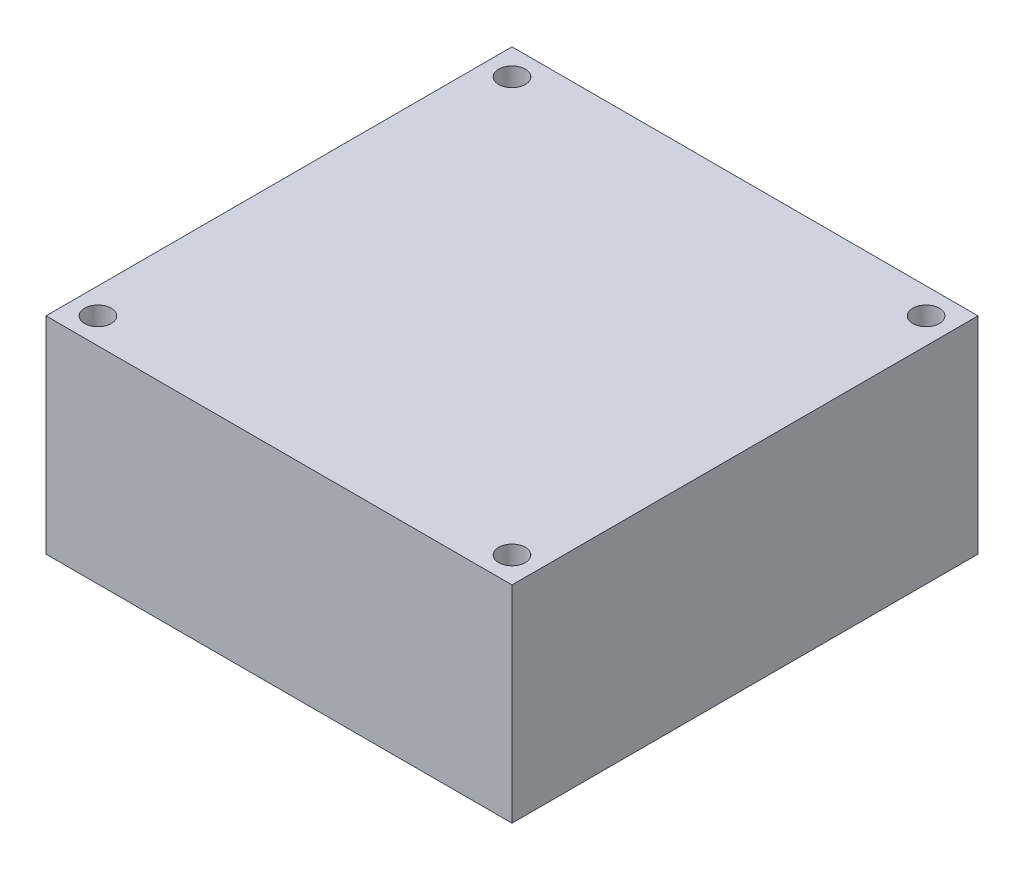
ISO-10303-21;
HEADER;
FILE_DESCRIPTION(('STEP AP214'),'2;1');
FILE_NAME('part.step','',(''),(''),'','','');
FILE_SCHEMA(('AUTOMOTIVE_DESIGN { 1 0 10303 214 1 1 1 1 }'));
ENDSEC;
DATA;
#1=APPLICATION_CONTEXT('core data for automotive mechanical design processes');
#2=APPLICATION_PROTOCOL_DEFINITION('international standard','automotive_design',2000,#1);
#3=PRODUCT_CONTEXT('',#1,'mechanical');
#4=PRODUCT('Part','Part','',(#3));
#5=PRODUCT_RELATED_PRODUCT_CATEGORY('part','',(#4));
#6=PRODUCT_DEFINITION_FORMATION('','',#4);
#7=PRODUCT_DEFINITION_CONTEXT('part definition',#1,'design');
#8=PRODUCT_DEFINITION('design','',#6,#7);
#9=PRODUCT_DEFINITION_SHAPE('','',#8);
#10=(LENGTH_UNIT() NAMED_UNIT(*) SI_UNIT(.MILLI.,.METRE.));
#11=(NAMED_UNIT(*) PLANE_ANGLE_UNIT() SI_UNIT($,.RADIAN.));
#12=(NAMED_UNIT(*) SI_UNIT($,.STERADIAN.) SOLID_ANGLE_UNIT());
#13=UNCERTAINTY_MEASURE_WITH_UNIT(LENGTH_MEASURE(1.E-05),#10,'distance_accuracy_value','');
#14=(GEOMETRIC_REPRESENTATION_CONTEXT(3) GLOBAL_UNCERTAINTY_ASSIGNED_CONTEXT((#13)) GLOBAL_UNIT_ASSIGNED_CONTEXT((#10,
#11,#12)) REPRESENTATION_CONTEXT('',''));
#15=CARTESIAN_POINT('',(0.,0.,0.));
#16=DIRECTION('',(0.,0.,1.));
#17=DIRECTION('',(1.,0.,0.));
#18=AXIS2_PLACEMENT_3D('',#15,#16,#17);
#19=CARTESIAN_POINT('',(35.,31.,-35.));
#20=DIRECTION('',(-1.,0.,0.));
#21=DIRECTION('',(0.,0.,1.));
#22=AXIS2_PLACEMENT_3D('',#19,#20,#21);
#23=PLANE('',#22);
#24=DIRECTION('',(0.,0.,-1.));
#25=VECTOR('',#24,1.);
#26=CARTESIAN_POINT('',(35.,0.,-35.));
#27=LINE('',#26,#25);
#28=CARTESIAN_POINT('',(35.,0.,35.));
#29=VERTEX_POINT('',#28);
#30=CARTESIAN_POINT('',(35.,0.,-35.));
#31=VERTEX_POINT('',#30);
#32=EDGE_CURVE('E96',#29,#31,#27,.T.);
#33=ORIENTED_EDGE('',*,*,#32,.T.);
#34=DIRECTION('',(0.,-1.,0.));
#35=VECTOR('',#34,1.);
#36=CARTESIAN_POINT('',(35.,31.,-35.));
#37=LINE('',#36,#35);
#38=CARTESIAN_POINT('',(35.,31.,-35.));
#39=VERTEX_POINT('',#38);
#40=EDGE_CURVE('E11',#39,#31,#37,.T.);
#41=ORIENTED_EDGE('',*,*,#40,.F.);
#42=DIRECTION('',(0.,0.,-1.));
#43=VECTOR('',#42,1.);
#44=CARTESIAN_POINT('',(35.,31.,-35.));
#45=LINE('',#44,#43);
#46=CARTESIAN_POINT('',(35.,31.,35.));
#47=VERTEX_POINT('',#46);
#48=EDGE_CURVE('E84',#47,#39,#45,.T.);
#49=ORIENTED_EDGE('',*,*,#48,.F.);
#50=DIRECTION('',(0.,-1.,0.));
#51=VECTOR('',#50,1.);
#52=CARTESIAN_POINT('',(35.,31.,35.));
#53=LINE('',#52,#51);
#54=EDGE_CURVE('E92',#47,#29,#53,.T.);
#55=ORIENTED_EDGE('',*,*,#54,.T.);
#56=EDGE_LOOP('',(#33,#41,#49,#55));
#57=FACE_BOUND('',#56,.T.);
#58=ADVANCED_FACE('F33',(#57),#23,.F.);
#59=CARTESIAN_POINT('',(-35.,31.,-35.));
#60=DIRECTION('',(0.,0.,1.));
#61=DIRECTION('',(1.,0.,0.));
#62=AXIS2_PLACEMENT_3D('',#59,#60,#61);
#63=PLANE('',#62);
#64=DIRECTION('',(-1.,0.,0.));
#65=VECTOR('',#64,1.);
#66=CARTESIAN_POINT('',(-35.,0.,-35.));
#67=LINE('',#66,#65);
#68=CARTESIAN_POINT('',(-35.,0.,-35.));
#69=VERTEX_POINT('',#68);
#70=EDGE_CURVE('E88',#31,#69,#67,.T.);
#71=ORIENTED_EDGE('',*,*,#70,.T.);
#72=DIRECTION('',(0.,-1.,0.));
#73=VECTOR('',#72,1.);
#74=CARTESIAN_POINT('',(-35.,31.,-35.));
#75=LINE('',#74,#73);
#76=CARTESIAN_POINT('',(-35.,31.,-35.));
#77=VERTEX_POINT('',#76);
#78=EDGE_CURVE('E41',#77,#69,#75,.T.);
#79=ORIENTED_EDGE('',*,*,#78,.F.);
#80=DIRECTION('',(-1.,0.,0.));
#81=VECTOR('',#80,1.);
#82=CARTESIAN_POINT('',(-35.,31.,-35.));
#83=LINE('',#82,#81);
#84=EDGE_CURVE('E79',#39,#77,#83,.T.);
#85=ORIENTED_EDGE('',*,*,#84,.F.);
#86=ORIENTED_EDGE('',*,*,#40,.T.);
#87=EDGE_LOOP('',(#71,#79,#85,#86));
#88=FACE_BOUND('',#87,.T.);
#89=ADVANCED_FACE('F87',(#88),#63,.F.);
#90=CARTESIAN_POINT('',(-35.,31.,-35.));
#91=DIRECTION('',(1.,0.,0.));
#92=DIRECTION('',(0.,0.,-1.));
#93=AXIS2_PLACEMENT_3D('',#90,#91,#92);
#94=PLANE('',#93);
#95=DIRECTION('',(0.,0.,1.));
#96=VECTOR('',#95,1.);
#97=CARTESIAN_POINT('',(-35.,0.,-35.));
#98=LINE('',#97,#96);
#99=CARTESIAN_POINT('',(-35.,0.,35.));
#100=VERTEX_POINT('',#99);
#101=EDGE_CURVE('E66',#69,#100,#98,.T.);
#102=ORIENTED_EDGE('',*,*,#101,.T.);
#103=DIRECTION('',(0.,-1.,0.));
#104=VECTOR('',#103,1.);
#105=CARTESIAN_POINT('',(-35.,31.,35.));
#106=LINE('',#105,#104);
#107=CARTESIAN_POINT('',(-35.,31.,35.));
#108=VERTEX_POINT('',#107);
#109=EDGE_CURVE('E89',#108,#100,#106,.T.);
#110=ORIENTED_EDGE('',*,*,#109,.F.);
#111=DIRECTION('',(0.,0.,1.));
#112=VECTOR('',#111,1.);
#113=CARTESIAN_POINT('',(-35.,31.,-35.));
#114=LINE('',#113,#112);
#115=EDGE_CURVE('E82',#77,#108,#114,.T.);
#116=ORIENTED_EDGE('',*,*,#115,.F.);
#117=ORIENTED_EDGE('',*,*,#78,.T.);
#118=EDGE_LOOP('',(#102,#110,#116,#117));
#119=FACE_BOUND('',#118,.T.);
#120=ADVANCED_FACE('F90',(#119),#94,.F.);
#121=CARTESIAN_POINT('',(-35.,31.,35.));
#122=DIRECTION('',(0.,0.,-1.));
#123=DIRECTION('',(-1.,0.,0.));
#124=AXIS2_PLACEMENT_3D('',#121,#122,#123);
#125=PLANE('',#124);
#126=DIRECTION('',(1.,0.,0.));
#127=VECTOR('',#126,1.);
#128=CARTESIAN_POINT('',(-35.,0.,35.));
#129=LINE('',#128,#127);
#130=EDGE_CURVE('E72',#100,#29,#129,.T.);
#131=ORIENTED_EDGE('',*,*,#130,.T.);
#132=ORIENTED_EDGE('',*,*,#54,.F.);
#133=DIRECTION('',(1.,0.,0.));
#134=VECTOR('',#133,1.);
#135=CARTESIAN_POINT('',(-35.,31.,35.));
#136=LINE('',#135,#134);
#137=EDGE_CURVE('E49',#108,#47,#136,.T.);
#138=ORIENTED_EDGE('',*,*,#137,.F.);
#139=ORIENTED_EDGE('',*,*,#109,.T.);
#140=EDGE_LOOP('',(#131,#132,#138,#139));
#141=FACE_BOUND('',#140,.T.);
#142=ADVANCED_FACE('F104',(#141),#125,.F.);
#143=CARTESIAN_POINT('',(0.,31.,0.));
#144=DIRECTION('',(0.,1.,0.));
#145=DIRECTION('',(0.,0.,1.));
#146=AXIS2_PLACEMENT_3D('',#143,#144,#145);
#147=PLANE('',#146);
#148=CARTESIAN_POINT('',(-31.1,31.,31.1));
#149=DIRECTION('',(0.,1.,0.));
#150=DIRECTION('',(0.,0.,1.));
#151=AXIS2_PLACEMENT_3D('',#148,#149,#150);
#152=CIRCLE('',#151,2.00000000000001);
#153=CARTESIAN_POINT('',(-31.1,31.,33.1));
#154=VERTEX_POINT('',#153);
#155=EDGE_CURVE('E128',#154,#154,#152,.T.);
#156=ORIENTED_EDGE('',*,*,#155,.F.);
#157=EDGE_LOOP('',(#156));
#158=FACE_BOUND('',#157,.T.);
#159=CARTESIAN_POINT('',(31.1,31.,31.1));
#160=DIRECTION('',(0.,1.,0.));
#161=DIRECTION('',(0.,0.,1.));
#162=AXIS2_PLACEMENT_3D('',#159,#160,#161);
#163=CIRCLE('',#162,2.00000000000001);
#164=CARTESIAN_POINT('',(31.1,31.,33.1));
#165=VERTEX_POINT('',#164);
#166=EDGE_CURVE('E122',#165,#165,#163,.T.);
#167=ORIENTED_EDGE('',*,*,#166,.F.);
#168=EDGE_LOOP('',(#167));
#169=FACE_BOUND('',#168,.T.);
#170=CARTESIAN_POINT('',(31.1,31.,-31.1));
#171=DIRECTION('',(0.,1.,0.));
#172=DIRECTION('',(0.,0.,1.));
#173=AXIS2_PLACEMENT_3D('',#170,#171,#172);
#174=CIRCLE('',#173,2.00000000000001);
#175=CARTESIAN_POINT('',(31.1,31.,-29.1));
#176=VERTEX_POINT('',#175);
#177=EDGE_CURVE('E116',#176,#176,#174,.T.);
#178=ORIENTED_EDGE('',*,*,#177,.F.);
#179=EDGE_LOOP('',(#178));
#180=FACE_BOUND('',#179,.T.);
#181=CARTESIAN_POINT('',(-31.1,31.,-31.1));
#182=DIRECTION('',(0.,1.,0.));
#183=DIRECTION('',(0.,0.,1.));
#184=AXIS2_PLACEMENT_3D('',#181,#182,#183);
#185=CIRCLE('',#184,2.00000000000001);
#186=CARTESIAN_POINT('',(-31.1,31.,-29.1));
#187=VERTEX_POINT('',#186);
#188=EDGE_CURVE('E110',#187,#187,#185,.T.);
#189=ORIENTED_EDGE('',*,*,#188,.F.);
#190=EDGE_LOOP('',(#189));
#191=FACE_BOUND('',#190,.T.);
#192=ORIENTED_EDGE('',*,*,#48,.T.);
#193=ORIENTED_EDGE('',*,*,#84,.T.);
#194=ORIENTED_EDGE('',*,*,#115,.T.);
#195=ORIENTED_EDGE('',*,*,#137,.T.);
#196=EDGE_LOOP('',(#192,#193,#194,#195));
#197=FACE_BOUND('',#196,.T.);
#198=ADVANCED_FACE('F80',(#158,#169,#180,#191,#197),#147,.T.);
#199=CARTESIAN_POINT('',(0.,0.,0.));
#200=DIRECTION('',(0.,1.,0.));
#201=DIRECTION('',(0.,0.,1.));
#202=AXIS2_PLACEMENT_3D('',#199,#200,#201);
#203=PLANE('',#202);
#204=CARTESIAN_POINT('',(-31.1,0.,31.1));
#205=DIRECTION('',(0.,1.,0.));
#206=DIRECTION('',(0.,0.,1.));
#207=AXIS2_PLACEMENT_3D('',#204,#205,#206);
#208=CIRCLE('',#207,2.00000000000001);
#209=CARTESIAN_POINT('',(-31.1,0.,33.1));
#210=VERTEX_POINT('',#209);
#211=EDGE_CURVE('E125',#210,#210,#208,.T.);
#212=ORIENTED_EDGE('',*,*,#211,.T.);
#213=EDGE_LOOP('',(#212));
#214=FACE_BOUND('',#213,.T.);
#215=CARTESIAN_POINT('',(31.1,0.,31.1));
#216=DIRECTION('',(0.,1.,0.));
#217=DIRECTION('',(0.,0.,1.));
#218=AXIS2_PLACEMENT_3D('',#215,#216,#217);
#219=CIRCLE('',#218,2.00000000000001);
#220=CARTESIAN_POINT('',(31.1,0.,33.1));
#221=VERTEX_POINT('',#220);
#222=EDGE_CURVE('E119',#221,#221,#219,.T.);
#223=ORIENTED_EDGE('',*,*,#222,.T.);
#224=EDGE_LOOP('',(#223));
#225=FACE_BOUND('',#224,.T.);
#226=CARTESIAN_POINT('',(31.1,0.,-31.1));
#227=DIRECTION('',(0.,1.,0.));
#228=DIRECTION('',(0.,0.,1.));
#229=AXIS2_PLACEMENT_3D('',#226,#227,#228);
#230=CIRCLE('',#229,2.00000000000001);
#231=CARTESIAN_POINT('',(31.1,0.,-29.1));
#232=VERTEX_POINT('',#231);
#233=EDGE_CURVE('E113',#232,#232,#230,.T.);
#234=ORIENTED_EDGE('',*,*,#233,.T.);
#235=EDGE_LOOP('',(#234));
#236=FACE_BOUND('',#235,.T.);
#237=CARTESIAN_POINT('',(-31.1,0.,-31.1));
#238=DIRECTION('',(0.,1.,0.));
#239=DIRECTION('',(0.,0.,1.));
#240=AXIS2_PLACEMENT_3D('',#237,#238,#239);
#241=CIRCLE('',#240,2.00000000000001);
#242=CARTESIAN_POINT('',(-31.1,0.,-29.1));
#243=VERTEX_POINT('',#242);
#244=EDGE_CURVE('E99',#243,#243,#241,.T.);
#245=ORIENTED_EDGE('',*,*,#244,.T.);
#246=EDGE_LOOP('',(#245));
#247=FACE_BOUND('',#246,.T.);
#248=ORIENTED_EDGE('',*,*,#32,.F.);
#249=ORIENTED_EDGE('',*,*,#130,.F.);
#250=ORIENTED_EDGE('',*,*,#101,.F.);
#251=ORIENTED_EDGE('',*,*,#70,.F.);
#252=EDGE_LOOP('',(#248,#249,#250,#251));
#253=FACE_BOUND('',#252,.T.);
#254=ADVANCED_FACE('F107',(#214,#225,#236,#247,#253),#203,.F.);
#255=CARTESIAN_POINT('',(-31.1,0.,-31.1));
#256=DIRECTION('',(0.,1.,0.));
#257=DIRECTION('',(0.,0.,1.));
#258=AXIS2_PLACEMENT_3D('',#255,#256,#257);
#259=CYLINDRICAL_SURFACE('',#258,2.00000000000001);
#260=ORIENTED_EDGE('',*,*,#244,.F.);
#261=EDGE_LOOP('',(#260));
#262=FACE_BOUND('',#261,.T.);
#263=ORIENTED_EDGE('',*,*,#188,.T.);
#264=EDGE_LOOP('',(#263));
#265=FACE_BOUND('',#264,.T.);
#266=ADVANCED_FACE('F152',(#262,#265),#259,.F.);
#267=CARTESIAN_POINT('',(31.1,0.,-31.1));
#268=DIRECTION('',(0.,1.,0.));
#269=DIRECTION('',(0.,0.,1.));
#270=AXIS2_PLACEMENT_3D('',#267,#268,#269);
#271=CYLINDRICAL_SURFACE('',#270,2.00000000000001);
#272=ORIENTED_EDGE('',*,*,#233,.F.);
#273=EDGE_LOOP('',(#272));
#274=FACE_BOUND('',#273,.T.);
#275=ORIENTED_EDGE('',*,*,#177,.T.);
#276=EDGE_LOOP('',(#275));
#277=FACE_BOUND('',#276,.T.);
#278=ADVANCED_FACE('F154',(#274,#277),#271,.F.);
#279=CARTESIAN_POINT('',(31.1,0.,31.1));
#280=DIRECTION('',(0.,1.,0.));
#281=DIRECTION('',(0.,0.,1.));
#282=AXIS2_PLACEMENT_3D('',#279,#280,#281);
#283=CYLINDRICAL_SURFACE('',#282,2.00000000000001);
#284=ORIENTED_EDGE('',*,*,#222,.F.);
#285=EDGE_LOOP('',(#284));
#286=FACE_BOUND('',#285,.T.);
#287=ORIENTED_EDGE('',*,*,#166,.T.);
#288=EDGE_LOOP('',(#287));
#289=FACE_BOUND('',#288,.T.);
#290=ADVANCED_FACE('F139',(#286,#289),#283,.F.);
#291=CARTESIAN_POINT('',(-31.1,0.,31.1));
#292=DIRECTION('',(0.,1.,0.));
#293=DIRECTION('',(0.,0.,1.));
#294=AXIS2_PLACEMENT_3D('',#291,#292,#293);
#295=CYLINDRICAL_SURFACE('',#294,2.00000000000001);
#296=ORIENTED_EDGE('',*,*,#211,.F.);
#297=EDGE_LOOP('',(#296));
#298=FACE_BOUND('',#297,.T.);
#299=ORIENTED_EDGE('',*,*,#155,.T.);
#300=EDGE_LOOP('',(#299));
#301=FACE_BOUND('',#300,.T.);
#302=ADVANCED_FACE('F136',(#298,#301),#295,.F.);
#303=CLOSED_SHELL('',(#58,#89,#120,#142,#198,#254,#266,#278,#290,#302));
#304=MANIFOLD_SOLID_BREP('B2',#303);
#305=ADVANCED_BREP_SHAPE_REPRESENTATION('',(#18,#304),#14);
#306=SHAPE_DEFINITION_REPRESENTATION(#9,#305);
ENDSEC;
END-ISO-10303-21;
